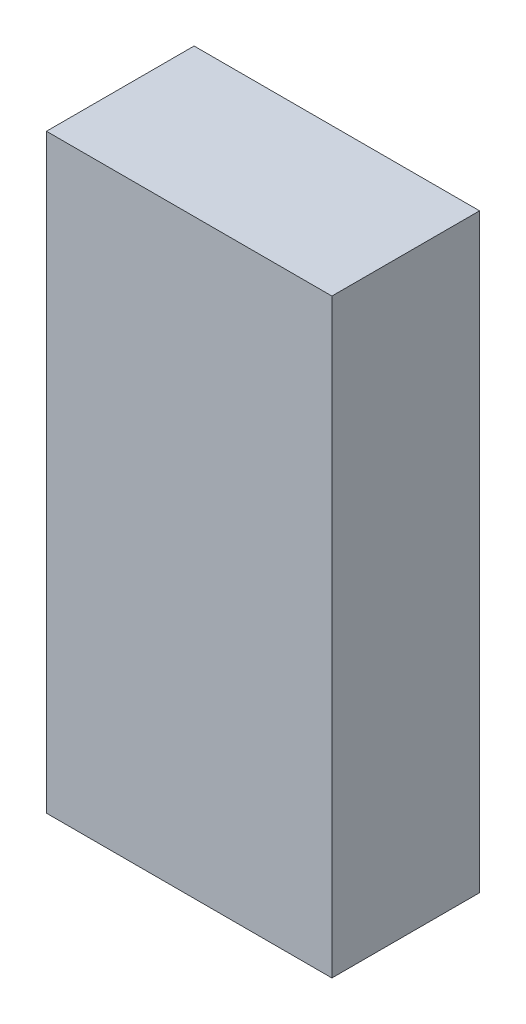
ISO-10303-21;
HEADER;
FILE_DESCRIPTION(('STEP AP214'),'2;1');
FILE_NAME('part.step','',(''),(''),'','','');
FILE_SCHEMA(('AUTOMOTIVE_DESIGN { 1 0 10303 214 1 1 1 1 }'));
ENDSEC;
DATA;
#1=APPLICATION_CONTEXT('core data for automotive mechanical design processes');
#2=APPLICATION_PROTOCOL_DEFINITION('international standard','automotive_design',2000,#1);
#3=PRODUCT_CONTEXT('',#1,'mechanical');
#4=PRODUCT('Part','Part','',(#3));
#5=PRODUCT_RELATED_PRODUCT_CATEGORY('part','',(#4));
#6=PRODUCT_DEFINITION_FORMATION('','',#4);
#7=PRODUCT_DEFINITION_CONTEXT('part definition',#1,'design');
#8=PRODUCT_DEFINITION('design','',#6,#7);
#9=PRODUCT_DEFINITION_SHAPE('','',#8);
#10=(LENGTH_UNIT() NAMED_UNIT(*) SI_UNIT(.MILLI.,.METRE.));
#11=(NAMED_UNIT(*) PLANE_ANGLE_UNIT() SI_UNIT($,.RADIAN.));
#12=(NAMED_UNIT(*) SI_UNIT($,.STERADIAN.) SOLID_ANGLE_UNIT());
#13=UNCERTAINTY_MEASURE_WITH_UNIT(LENGTH_MEASURE(1.E-05),#10,'distance_accuracy_value','');
#14=(GEOMETRIC_REPRESENTATION_CONTEXT(3) GLOBAL_UNCERTAINTY_ASSIGNED_CONTEXT((#13)) GLOBAL_UNIT_ASSIGNED_CONTEXT((#10,
#11,#12)) REPRESENTATION_CONTEXT('',''));
#15=CARTESIAN_POINT('',(0.,0.,0.));
#16=DIRECTION('',(0.,0.,1.));
#17=DIRECTION('',(1.,0.,0.));
#18=AXIS2_PLACEMENT_3D('',#15,#16,#17);
#19=CARTESIAN_POINT('',(0.,1800.,0.));
#20=DIRECTION('',(1.,0.,0.));
#21=DIRECTION('',(0.,0.,-1.));
#22=AXIS2_PLACEMENT_3D('',#19,#20,#21);
#23=PLANE('',#22);
#24=DIRECTION('',(0.,0.,1.));
#25=VECTOR('',#24,1.);
#26=CARTESIAN_POINT('',(0.,0.,0.));
#27=LINE('',#26,#25);
#28=CARTESIAN_POINT('',(0.,0.,-450.));
#29=VERTEX_POINT('',#28);
#30=CARTESIAN_POINT('',(0.,0.,0.));
#31=VERTEX_POINT('',#30);
#32=EDGE_CURVE('E96',#29,#31,#27,.T.);
#33=ORIENTED_EDGE('',*,*,#32,.T.);
#34=DIRECTION('',(0.,-1.,0.));
#35=VECTOR('',#34,1.);
#36=CARTESIAN_POINT('',(0.,1800.,0.));
#37=LINE('',#36,#35);
#38=CARTESIAN_POINT('',(0.,1800.,0.));
#39=VERTEX_POINT('',#38);
#40=EDGE_CURVE('E11',#39,#31,#37,.T.);
#41=ORIENTED_EDGE('',*,*,#40,.F.);
#42=DIRECTION('',(0.,0.,1.));
#43=VECTOR('',#42,1.);
#44=CARTESIAN_POINT('',(0.,1800.,0.));
#45=LINE('',#44,#43);
#46=CARTESIAN_POINT('',(0.,1800.,-450.));
#47=VERTEX_POINT('',#46);
#48=EDGE_CURVE('E84',#47,#39,#45,.T.);
#49=ORIENTED_EDGE('',*,*,#48,.F.);
#50=DIRECTION('',(0.,-1.,0.));
#51=VECTOR('',#50,1.);
#52=CARTESIAN_POINT('',(0.,1800.,-450.));
#53=LINE('',#52,#51);
#54=EDGE_CURVE('E92',#47,#29,#53,.T.);
#55=ORIENTED_EDGE('',*,*,#54,.T.);
#56=EDGE_LOOP('',(#33,#41,#49,#55));
#57=FACE_BOUND('',#56,.T.);
#58=ADVANCED_FACE('F33',(#57),#23,.F.);
#59=CARTESIAN_POINT('',(0.,1800.,0.));
#60=DIRECTION('',(0.,0.,-1.));
#61=DIRECTION('',(-1.,0.,0.));
#62=AXIS2_PLACEMENT_3D('',#59,#60,#61);
#63=PLANE('',#62);
#64=DIRECTION('',(1.,0.,0.));
#65=VECTOR('',#64,1.);
#66=CARTESIAN_POINT('',(0.,0.,0.));
#67=LINE('',#66,#65);
#68=CARTESIAN_POINT('',(870.,0.,0.));
#69=VERTEX_POINT('',#68);
#70=EDGE_CURVE('E88',#31,#69,#67,.T.);
#71=ORIENTED_EDGE('',*,*,#70,.T.);
#72=DIRECTION('',(0.,-1.,0.));
#73=VECTOR('',#72,1.);
#74=CARTESIAN_POINT('',(870.,1800.,0.));
#75=LINE('',#74,#73);
#76=CARTESIAN_POINT('',(870.,1800.,0.));
#77=VERTEX_POINT('',#76);
#78=EDGE_CURVE('E41',#77,#69,#75,.T.);
#79=ORIENTED_EDGE('',*,*,#78,.F.);
#80=DIRECTION('',(1.,0.,0.));
#81=VECTOR('',#80,1.);
#82=CARTESIAN_POINT('',(0.,1800.,0.));
#83=LINE('',#82,#81);
#84=EDGE_CURVE('E79',#39,#77,#83,.T.);
#85=ORIENTED_EDGE('',*,*,#84,.F.);
#86=ORIENTED_EDGE('',*,*,#40,.T.);
#87=EDGE_LOOP('',(#71,#79,#85,#86));
#88=FACE_BOUND('',#87,.T.);
#89=ADVANCED_FACE('F87',(#88),#63,.F.);
#90=CARTESIAN_POINT('',(870.,1800.,0.));
#91=DIRECTION('',(-1.,0.,0.));
#92=DIRECTION('',(0.,0.,1.));
#93=AXIS2_PLACEMENT_3D('',#90,#91,#92);
#94=PLANE('',#93);
#95=DIRECTION('',(0.,0.,-1.));
#96=VECTOR('',#95,1.);
#97=CARTESIAN_POINT('',(870.,0.,0.));
#98=LINE('',#97,#96);
#99=CARTESIAN_POINT('',(870.,0.,-450.));
#100=VERTEX_POINT('',#99);
#101=EDGE_CURVE('E66',#69,#100,#98,.T.);
#102=ORIENTED_EDGE('',*,*,#101,.T.);
#103=DIRECTION('',(0.,-1.,0.));
#104=VECTOR('',#103,1.);
#105=CARTESIAN_POINT('',(870.,1800.,-450.));
#106=LINE('',#105,#104);
#107=CARTESIAN_POINT('',(870.,1800.,-450.));
#108=VERTEX_POINT('',#107);
#109=EDGE_CURVE('E89',#108,#100,#106,.T.);
#110=ORIENTED_EDGE('',*,*,#109,.F.);
#111=DIRECTION('',(0.,0.,-1.));
#112=VECTOR('',#111,1.);
#113=CARTESIAN_POINT('',(870.,1800.,0.));
#114=LINE('',#113,#112);
#115=EDGE_CURVE('E82',#77,#108,#114,.T.);
#116=ORIENTED_EDGE('',*,*,#115,.F.);
#117=ORIENTED_EDGE('',*,*,#78,.T.);
#118=EDGE_LOOP('',(#102,#110,#116,#117));
#119=FACE_BOUND('',#118,.T.);
#120=ADVANCED_FACE('F90',(#119),#94,.F.);
#121=CARTESIAN_POINT('',(0.,1800.,-450.));
#122=DIRECTION('',(0.,0.,1.));
#123=DIRECTION('',(1.,0.,0.));
#124=AXIS2_PLACEMENT_3D('',#121,#122,#123);
#125=PLANE('',#124);
#126=DIRECTION('',(-1.,0.,0.));
#127=VECTOR('',#126,1.);
#128=CARTESIAN_POINT('',(0.,0.,-450.));
#129=LINE('',#128,#127);
#130=EDGE_CURVE('E72',#100,#29,#129,.T.);
#131=ORIENTED_EDGE('',*,*,#130,.T.);
#132=ORIENTED_EDGE('',*,*,#54,.F.);
#133=DIRECTION('',(-1.,0.,0.));
#134=VECTOR('',#133,1.);
#135=CARTESIAN_POINT('',(0.,1800.,-450.));
#136=LINE('',#135,#134);
#137=EDGE_CURVE('E49',#108,#47,#136,.T.);
#138=ORIENTED_EDGE('',*,*,#137,.F.);
#139=ORIENTED_EDGE('',*,*,#109,.T.);
#140=EDGE_LOOP('',(#131,#132,#138,#139));
#141=FACE_BOUND('',#140,.T.);
#142=ADVANCED_FACE('F103',(#141),#125,.F.);
#143=CARTESIAN_POINT('',(0.,1800.,0.));
#144=DIRECTION('',(0.,-1.,0.));
#145=DIRECTION('',(0.,0.,-1.));
#146=AXIS2_PLACEMENT_3D('',#143,#144,#145);
#147=PLANE('',#146);
#148=ORIENTED_EDGE('',*,*,#48,.T.);
#149=ORIENTED_EDGE('',*,*,#84,.T.);
#150=ORIENTED_EDGE('',*,*,#115,.T.);
#151=ORIENTED_EDGE('',*,*,#137,.T.);
#152=EDGE_LOOP('',(#148,#149,#150,#151));
#153=FACE_BOUND('',#152,.T.);
#154=ADVANCED_FACE('F80',(#153),#147,.F.);
#155=CARTESIAN_POINT('',(0.,0.,0.));
#156=DIRECTION('',(0.,-1.,0.));
#157=DIRECTION('',(0.,0.,-1.));
#158=AXIS2_PLACEMENT_3D('',#155,#156,#157);
#159=PLANE('',#158);
#160=ORIENTED_EDGE('',*,*,#32,.F.);
#161=ORIENTED_EDGE('',*,*,#130,.F.);
#162=ORIENTED_EDGE('',*,*,#101,.F.);
#163=ORIENTED_EDGE('',*,*,#70,.F.);
#164=EDGE_LOOP('',(#160,#161,#162,#163));
#165=FACE_BOUND('',#164,.T.);
#166=ADVANCED_FACE('F106',(#165),#159,.T.);
#167=CLOSED_SHELL('',(#58,#89,#120,#142,#154,#166));
#168=MANIFOLD_SOLID_BREP('B2',#167);
#169=ADVANCED_BREP_SHAPE_REPRESENTATION('',(#18,#168),#14);
#170=SHAPE_DEFINITION_REPRESENTATION(#9,#169);
ENDSEC;
END-ISO-10303-21;
